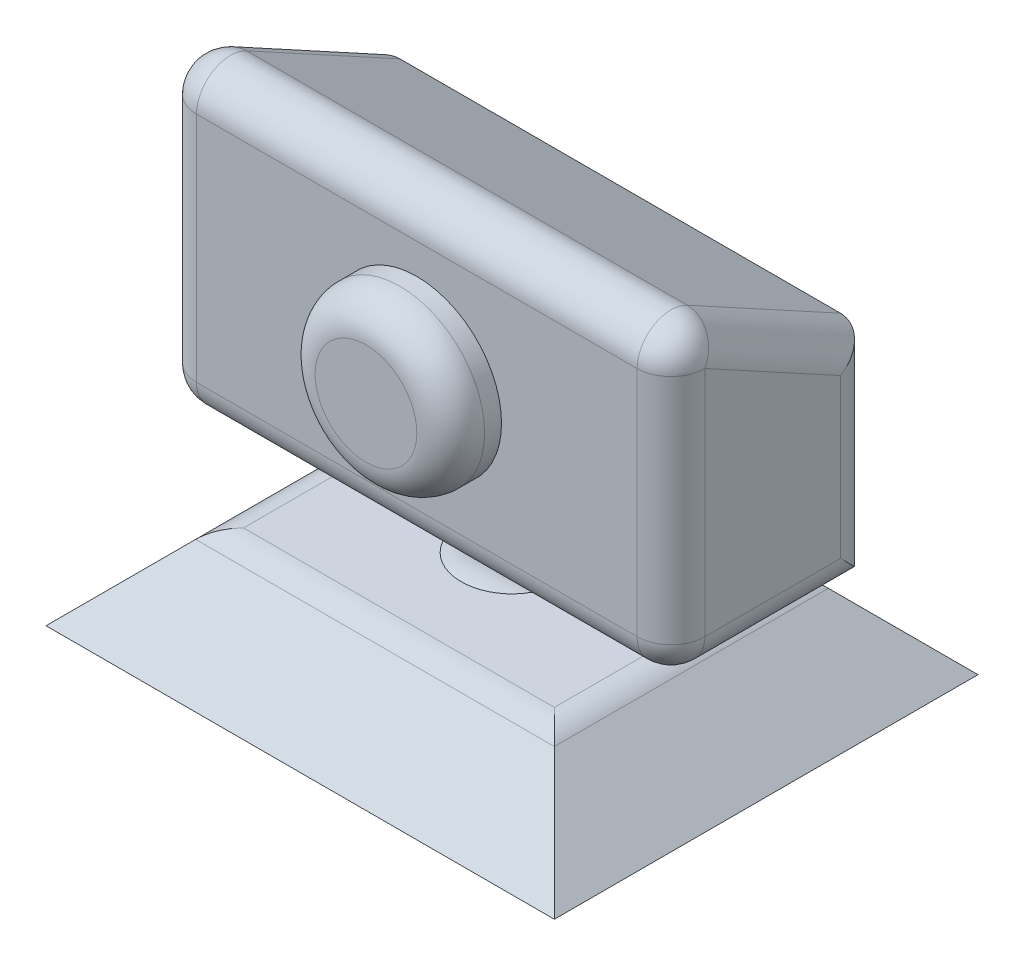
ISO-10303-21;
HEADER;
FILE_DESCRIPTION(('STEP AP214'),'2;1');
FILE_NAME('part.step','',(''),(''),'','','');
FILE_SCHEMA(('AUTOMOTIVE_DESIGN { 1 0 10303 214 1 1 1 1 }'));
ENDSEC;
DATA;
#1=APPLICATION_CONTEXT('core data for automotive mechanical design processes');
#2=APPLICATION_PROTOCOL_DEFINITION('international standard','automotive_design',2000,#1);
#3=PRODUCT_CONTEXT('',#1,'mechanical');
#4=PRODUCT('Part','Part','',(#3));
#5=PRODUCT_RELATED_PRODUCT_CATEGORY('part','',(#4));
#6=PRODUCT_DEFINITION_FORMATION('','',#4);
#7=PRODUCT_DEFINITION_CONTEXT('part definition',#1,'design');
#8=PRODUCT_DEFINITION('design','',#6,#7);
#9=PRODUCT_DEFINITION_SHAPE('','',#8);
#10=(LENGTH_UNIT() NAMED_UNIT(*) SI_UNIT(.MILLI.,.METRE.));
#11=(NAMED_UNIT(*) PLANE_ANGLE_UNIT() SI_UNIT($,.RADIAN.));
#12=(NAMED_UNIT(*) SI_UNIT($,.STERADIAN.) SOLID_ANGLE_UNIT());
#13=UNCERTAINTY_MEASURE_WITH_UNIT(LENGTH_MEASURE(1.E-05),#10,'distance_accuracy_value','');
#14=(GEOMETRIC_REPRESENTATION_CONTEXT(3) GLOBAL_UNCERTAINTY_ASSIGNED_CONTEXT((#13)) GLOBAL_UNIT_ASSIGNED_CONTEXT((#10,
#11,#12)) REPRESENTATION_CONTEXT('',''));
#15=CARTESIAN_POINT('',(0.,0.,0.));
#16=DIRECTION('',(0.,0.,1.));
#17=DIRECTION('',(1.,0.,0.));
#18=AXIS2_PLACEMENT_3D('',#15,#16,#17);
#19=CARTESIAN_POINT('',(0.,5.,0.));
#20=DIRECTION('',(0.,1.,0.));
#21=DIRECTION('',(0.,0.,1.));
#22=AXIS2_PLACEMENT_3D('',#19,#20,#21);
#23=PLANE('',#22);
#24=DIRECTION('',(0.,0.,-1.));
#25=VECTOR('',#24,1.);
#26=CARTESIAN_POINT('',(9.17157287525379,5.,0.));
#27=LINE('',#26,#25);
#28=CARTESIAN_POINT('',(9.17157287525379,5.,6.67157287525379));
#29=VERTEX_POINT('',#28);
#30=CARTESIAN_POINT('',(9.17157287525379,5.,-6.67157287525379));
#31=VERTEX_POINT('',#30);
#32=EDGE_CURVE('E288',#29,#31,#27,.T.);
#33=ORIENTED_EDGE('',*,*,#32,.T.);
#34=DIRECTION('',(-1.,0.,0.));
#35=VECTOR('',#34,1.);
#36=CARTESIAN_POINT('',(0.,5.,-6.67157287525379));
#37=LINE('',#36,#35);
#38=CARTESIAN_POINT('',(-9.17157287525379,5.,-6.67157287525379));
#39=VERTEX_POINT('',#38);
#40=EDGE_CURVE('E290',#31,#39,#37,.T.);
#41=ORIENTED_EDGE('',*,*,#40,.T.);
#42=DIRECTION('',(0.,0.,1.));
#43=VECTOR('',#42,1.);
#44=CARTESIAN_POINT('',(-9.17157287525379,5.,0.));
#45=LINE('',#44,#43);
#46=CARTESIAN_POINT('',(-9.17157287525379,5.,6.67157287525379));
#47=VERTEX_POINT('',#46);
#48=EDGE_CURVE('E236',#39,#47,#45,.T.);
#49=ORIENTED_EDGE('',*,*,#48,.T.);
#50=DIRECTION('',(1.,0.,0.));
#51=VECTOR('',#50,1.);
#52=CARTESIAN_POINT('',(0.,5.,6.67157287525379));
#53=LINE('',#52,#51);
#54=EDGE_CURVE('E286',#47,#29,#53,.T.);
#55=ORIENTED_EDGE('',*,*,#54,.T.);
#56=EDGE_LOOP('',(#33,#41,#49,#55));
#57=FACE_BOUND('',#56,.T.);
#58=CARTESIAN_POINT('',(0.,5.,0.));
#59=DIRECTION('',(0.,-1.,0.));
#60=DIRECTION('',(1.,0.,0.));
#61=AXIS2_PLACEMENT_3D('',#58,#59,#60);
#62=CIRCLE('',#61,3.);
#63=CARTESIAN_POINT('',(3.,5.,0.));
#64=VERTEX_POINT('',#63);
#65=EDGE_CURVE('E184',#64,#64,#62,.T.);
#66=ORIENTED_EDGE('',*,*,#65,.T.);
#67=EDGE_LOOP('',(#66));
#68=FACE_BOUND('',#67,.T.);
#69=ADVANCED_FACE('F44',(#57,#68),#23,.T.);
#70=CARTESIAN_POINT('',(0.,0.,0.));
#71=DIRECTION('',(0.,1.,0.));
#72=DIRECTION('',(0.,0.,1.));
#73=AXIS2_PLACEMENT_3D('',#70,#71,#72);
#74=PLANE('',#73);
#75=DIRECTION('',(0.,0.,-1.));
#76=VECTOR('',#75,1.);
#77=CARTESIAN_POINT('',(15.,0.,-12.5));
#78=LINE('',#77,#76);
#79=CARTESIAN_POINT('',(15.,0.,12.5));
#80=VERTEX_POINT('',#79);
#81=CARTESIAN_POINT('',(15.,0.,-12.5));
#82=VERTEX_POINT('',#81);
#83=EDGE_CURVE('E164',#80,#82,#78,.T.);
#84=ORIENTED_EDGE('',*,*,#83,.F.);
#85=DIRECTION('',(1.,0.,0.));
#86=VECTOR('',#85,1.);
#87=CARTESIAN_POINT('',(-15.,0.,12.5));
#88=LINE('',#87,#86);
#89=CARTESIAN_POINT('',(-15.,0.,12.5));
#90=VERTEX_POINT('',#89);
#91=EDGE_CURVE('E188',#90,#80,#88,.T.);
#92=ORIENTED_EDGE('',*,*,#91,.F.);
#93=DIRECTION('',(0.,0.,1.));
#94=VECTOR('',#93,1.);
#95=CARTESIAN_POINT('',(-15.,0.,-12.5));
#96=LINE('',#95,#94);
#97=CARTESIAN_POINT('',(-15.,0.,-12.5));
#98=VERTEX_POINT('',#97);
#99=EDGE_CURVE('E167',#98,#90,#96,.T.);
#100=ORIENTED_EDGE('',*,*,#99,.F.);
#101=DIRECTION('',(-1.,0.,0.));
#102=VECTOR('',#101,1.);
#103=CARTESIAN_POINT('',(-15.,0.,-12.5));
#104=LINE('',#103,#102);
#105=EDGE_CURVE('E159',#82,#98,#104,.T.);
#106=ORIENTED_EDGE('',*,*,#105,.F.);
#107=EDGE_LOOP('',(#84,#92,#100,#106));
#108=FACE_BOUND('',#107,.T.);
#109=ADVANCED_FACE('F161',(#108),#74,.F.);
#110=CARTESIAN_POINT('',(0.,5.,-7.49999999999998));
#111=DIRECTION('',(0.,0.707106781186549,-0.707106781186546));
#112=DIRECTION('',(1.,0.,0.));
#113=AXIS2_PLACEMENT_3D('',#110,#111,#112);
#114=PLANE('',#113);
#115=DIRECTION('',(0.577350269189627,0.577350269189624,0.577350269189626));
#116=VECTOR('',#115,1.);
#117=CARTESIAN_POINT('',(-6.66666666666665,8.33333333333333,-4.16666666666664));
#118=LINE('',#117,#116);
#119=CARTESIAN_POINT('',(-10.5857864376269,4.4142135623731,-8.08578643762688));
#120=VERTEX_POINT('',#119);
#121=EDGE_CURVE('E176',#120,#98,#118,.F.);
#122=ORIENTED_EDGE('',*,*,#121,.F.);
#123=DIRECTION('',(-1.,0.,0.));
#124=VECTOR('',#123,1.);
#125=CARTESIAN_POINT('',(0.,4.4142135623731,-8.08578643762688));
#126=LINE('',#125,#124);
#127=CARTESIAN_POINT('',(10.5857864376269,4.4142135623731,-8.08578643762688));
#128=VERTEX_POINT('',#127);
#129=EDGE_CURVE('E175',#120,#128,#126,.F.);
#130=ORIENTED_EDGE('',*,*,#129,.T.);
#131=DIRECTION('',(-0.577350269189626,0.577350269189625,0.577350269189627));
#132=VECTOR('',#131,1.);
#133=CARTESIAN_POINT('',(7.49999999999998,7.49999999999999,-4.99999999999998));
#134=LINE('',#133,#132);
#135=EDGE_CURVE('E172',#82,#128,#134,.T.);
#136=ORIENTED_EDGE('',*,*,#135,.F.);
#137=ORIENTED_EDGE('',*,*,#105,.T.);
#138=EDGE_LOOP('',(#122,#130,#136,#137));
#139=FACE_BOUND('',#138,.T.);
#140=ADVANCED_FACE('F173',(#139),#114,.T.);
#141=CARTESIAN_POINT('',(-9.99999999999998,5.,0.));
#142=DIRECTION('',(-0.707106781186546,0.707106781186549,0.));
#143=DIRECTION('',(0.,0.,-1.));
#144=AXIS2_PLACEMENT_3D('',#141,#142,#143);
#145=PLANE('',#144);
#146=DIRECTION('',(0.577350269189626,0.577350269189625,-0.577350269189627));
#147=VECTOR('',#146,1.);
#148=CARTESIAN_POINT('',(-7.49999999999998,7.49999999999999,4.99999999999998));
#149=LINE('',#148,#147);
#150=CARTESIAN_POINT('',(-10.5857864376269,4.4142135623731,8.08578643762688));
#151=VERTEX_POINT('',#150);
#152=EDGE_CURVE('E177',#151,#90,#149,.F.);
#153=ORIENTED_EDGE('',*,*,#152,.F.);
#154=DIRECTION('',(0.,0.,1.));
#155=VECTOR('',#154,1.);
#156=CARTESIAN_POINT('',(-10.5857864376269,4.4142135623731,0.));
#157=LINE('',#156,#155);
#158=EDGE_CURVE('E296',#151,#120,#157,.F.);
#159=ORIENTED_EDGE('',*,*,#158,.T.);
#160=ORIENTED_EDGE('',*,*,#121,.T.);
#161=ORIENTED_EDGE('',*,*,#99,.T.);
#162=EDGE_LOOP('',(#153,#159,#160,#161));
#163=FACE_BOUND('',#162,.T.);
#164=ADVANCED_FACE('F346',(#163),#145,.T.);
#165=CARTESIAN_POINT('',(9.99999999999997,5.,0.));
#166=DIRECTION('',(0.707106781186546,0.707106781186549,0.));
#167=DIRECTION('',(0.,0.,1.));
#168=AXIS2_PLACEMENT_3D('',#165,#166,#167);
#169=PLANE('',#168);
#170=ORIENTED_EDGE('',*,*,#135,.T.);
#171=DIRECTION('',(0.,0.,-1.));
#172=VECTOR('',#171,1.);
#173=CARTESIAN_POINT('',(10.5857864376269,4.4142135623731,0.));
#174=LINE('',#173,#172);
#175=CARTESIAN_POINT('',(10.5857864376269,4.4142135623731,8.08578643762688));
#176=VERTEX_POINT('',#175);
#177=EDGE_CURVE('E67',#128,#176,#174,.F.);
#178=ORIENTED_EDGE('',*,*,#177,.T.);
#179=DIRECTION('',(0.577350269189627,-0.577350269189624,0.577350269189626));
#180=VECTOR('',#179,1.);
#181=CARTESIAN_POINT('',(7.49999999999998,7.49999999999999,4.99999999999998));
#182=LINE('',#181,#180);
#183=EDGE_CURVE('E180',#80,#176,#182,.F.);
#184=ORIENTED_EDGE('',*,*,#183,.F.);
#185=ORIENTED_EDGE('',*,*,#83,.T.);
#186=EDGE_LOOP('',(#170,#178,#184,#185));
#187=FACE_BOUND('',#186,.T.);
#188=ADVANCED_FACE('F179',(#187),#169,.T.);
#189=CARTESIAN_POINT('',(0.,5.,7.49999999999998));
#190=DIRECTION('',(0.,0.707106781186549,0.707106781186546));
#191=DIRECTION('',(-1.,0.,0.));
#192=AXIS2_PLACEMENT_3D('',#189,#190,#191);
#193=PLANE('',#192);
#194=ORIENTED_EDGE('',*,*,#183,.T.);
#195=DIRECTION('',(1.,0.,0.));
#196=VECTOR('',#195,1.);
#197=CARTESIAN_POINT('',(0.,4.4142135623731,8.08578643762688));
#198=LINE('',#197,#196);
#199=EDGE_CURVE('E59',#176,#151,#198,.F.);
#200=ORIENTED_EDGE('',*,*,#199,.T.);
#201=ORIENTED_EDGE('',*,*,#152,.T.);
#202=ORIENTED_EDGE('',*,*,#91,.T.);
#203=EDGE_LOOP('',(#194,#200,#201,#202));
#204=FACE_BOUND('',#203,.T.);
#205=ADVANCED_FACE('F335',(#204),#193,.T.);
#206=CARTESIAN_POINT('',(0.,6.5,0.));
#207=DIRECTION('',(0.,-1.,0.));
#208=DIRECTION('',(1.,0.,0.));
#209=AXIS2_PLACEMENT_3D('',#206,#207,#208);
#210=TOROIDAL_SURFACE('',#209,4.50000000000001,2.12132034355965);
#211=CARTESIAN_POINT('',(0.,8.,0.));
#212=DIRECTION('',(0.,-1.,0.));
#213=DIRECTION('',(1.,0.,0.));
#214=AXIS2_PLACEMENT_3D('',#211,#212,#213);
#215=CIRCLE('',#214,3.);
#216=CARTESIAN_POINT('',(3.,8.,0.));
#217=VERTEX_POINT('',#216);
#218=EDGE_CURVE('E735',#217,#217,#215,.T.);
#219=ORIENTED_EDGE('',*,*,#218,.T.);
#220=EDGE_LOOP('',(#219));
#221=FACE_BOUND('',#220,.T.);
#222=ORIENTED_EDGE('',*,*,#65,.F.);
#223=EDGE_LOOP('',(#222));
#224=FACE_BOUND('',#223,.T.);
#225=ADVANCED_FACE('F331',(#221,#224),#210,.F.);
#226=CARTESIAN_POINT('',(15.,20.5324967551476,-6.38322096761608));
#227=DIRECTION('',(0.,0.,1.));
#228=DIRECTION('',(1.,0.,0.));
#229=AXIS2_PLACEMENT_3D('',#226,#227,#228);
#230=PLANE('',#229);
#231=DIRECTION('',(-1.,0.,0.));
#232=VECTOR('',#231,1.);
#233=CARTESIAN_POINT('',(15.,20.5324967551476,-6.38322096761608));
#234=LINE('',#233,#232);
#235=CARTESIAN_POINT('',(13.,20.5324967551476,-6.38322096761608));
#236=VERTEX_POINT('',#235);
#237=CARTESIAN_POINT('',(-13.,20.5324967551476,-6.38322096761608));
#238=VERTEX_POINT('',#237);
#239=EDGE_CURVE('E738',#236,#238,#234,.T.);
#240=ORIENTED_EDGE('',*,*,#239,.F.);
#241=DIRECTION('',(0.,1.,0.));
#242=VECTOR('',#241,1.);
#243=CARTESIAN_POINT('',(13.,8.,-6.38322096761608));
#244=LINE('',#243,#242);
#245=CARTESIAN_POINT('',(13.,8.,-6.38322096761608));
#246=VERTEX_POINT('',#245);
#247=EDGE_CURVE('E216',#236,#246,#244,.F.);
#248=ORIENTED_EDGE('',*,*,#247,.T.);
#249=DIRECTION('',(-1.,0.,0.));
#250=VECTOR('',#249,1.);
#251=CARTESIAN_POINT('',(15.,8.,-6.38322096761608));
#252=LINE('',#251,#250);
#253=CARTESIAN_POINT('',(-13.,8.,-6.38322096761608));
#254=VERTEX_POINT('',#253);
#255=EDGE_CURVE('E284',#246,#254,#252,.T.);
#256=ORIENTED_EDGE('',*,*,#255,.T.);
#257=DIRECTION('',(0.,1.,0.));
#258=VECTOR('',#257,1.);
#259=CARTESIAN_POINT('',(-13.,20.5324967551476,-6.38322096761608));
#260=LINE('',#259,#258);
#261=EDGE_CURVE('E214',#254,#238,#260,.T.);
#262=ORIENTED_EDGE('',*,*,#261,.T.);
#263=EDGE_LOOP('',(#240,#248,#256,#262));
#264=FACE_BOUND('',#263,.T.);
#265=ADVANCED_FACE('F625',(#264),#230,.F.);
#266=CARTESIAN_POINT('',(15.,27.0750004522799,5.61677903238392));
#267=DIRECTION('',(0.,-0.877986317810887,0.478685727525775));
#268=DIRECTION('',(0.,-0.478685727525775,-0.877986317810887));
#269=AXIS2_PLACEMENT_3D('',#266,#267,#268);
#270=PLANE('',#269);
#271=DIRECTION('',(-1.,0.,0.));
#272=VECTOR('',#271,1.);
#273=CARTESIAN_POINT('',(15.,25.4626159790743,2.65940757733238));
#274=LINE('',#273,#272);
#275=CARTESIAN_POINT('',(-13.,25.4626159790743,2.65940757733238));
#276=VERTEX_POINT('',#275);
#277=CARTESIAN_POINT('',(13.,25.4626159790743,2.65940757733238));
#278=VERTEX_POINT('',#277);
#279=EDGE_CURVE('E208',#276,#278,#274,.F.);
#280=ORIENTED_EDGE('',*,*,#279,.T.);
#281=DIRECTION('',(0.,0.478685727525775,0.877986317810887));
#282=VECTOR('',#281,1.);
#283=CARTESIAN_POINT('',(13.,20.5324967551476,-6.38322096761608));
#284=LINE('',#283,#282);
#285=EDGE_CURVE('E212',#278,#236,#284,.F.);
#286=ORIENTED_EDGE('',*,*,#285,.T.);
#287=ORIENTED_EDGE('',*,*,#239,.T.);
#288=DIRECTION('',(0.,0.478685727525775,0.877986317810887));
#289=VECTOR('',#288,1.);
#290=CARTESIAN_POINT('',(-13.,27.0750004522799,5.61677903238392));
#291=LINE('',#290,#289);
#292=EDGE_CURVE('E210',#238,#276,#291,.T.);
#293=ORIENTED_EDGE('',*,*,#292,.T.);
#294=EDGE_LOOP('',(#280,#286,#287,#293));
#295=FACE_BOUND('',#294,.T.);
#296=ADVANCED_FACE('F616',(#295),#270,.F.);
#297=CARTESIAN_POINT('',(15.,27.0750004522799,5.61677903238392));
#298=DIRECTION('',(0.,0.,-1.));
#299=DIRECTION('',(0.,1.,0.));
#300=AXIS2_PLACEMENT_3D('',#297,#298,#299);
#301=PLANE('',#300);
#302=CARTESIAN_POINT('',(0.,16.913633245173,5.61677903238392));
#303=DIRECTION('',(0.,0.,-1.));
#304=DIRECTION('',(0.,1.,0.));
#305=AXIS2_PLACEMENT_3D('',#302,#303,#304);
#306=CIRCLE('',#305,5.);
#307=CARTESIAN_POINT('',(0.,21.913633245173,5.61677903238392));
#308=VERTEX_POINT('',#307);
#309=EDGE_CURVE('E298',#308,#308,#306,.F.);
#310=ORIENTED_EDGE('',*,*,#309,.F.);
#311=EDGE_LOOP('',(#310));
#312=FACE_BOUND('',#311,.T.);
#313=DIRECTION('',(0.,-1.,0.));
#314=VECTOR('',#313,1.);
#315=CARTESIAN_POINT('',(13.,27.0750004522799,5.61677903238392));
#316=LINE('',#315,#314);
#317=CARTESIAN_POINT('',(13.,10.,5.61677903238392));
#318=VERTEX_POINT('',#317);
#319=CARTESIAN_POINT('',(13.,23.7066433434525,5.61677903238392));
#320=VERTEX_POINT('',#319);
#321=EDGE_CURVE('E231',#318,#320,#316,.F.);
#322=ORIENTED_EDGE('',*,*,#321,.T.);
#323=DIRECTION('',(-1.,0.,0.));
#324=VECTOR('',#323,1.);
#325=CARTESIAN_POINT('',(15.,23.7066433434525,5.61677903238392));
#326=LINE('',#325,#324);
#327=CARTESIAN_POINT('',(-13.,23.7066433434525,5.61677903238392));
#328=VERTEX_POINT('',#327);
#329=EDGE_CURVE('E233',#320,#328,#326,.T.);
#330=ORIENTED_EDGE('',*,*,#329,.T.);
#331=DIRECTION('',(0.,-1.,0.));
#332=VECTOR('',#331,1.);
#333=CARTESIAN_POINT('',(-13.,27.0750004522799,5.61677903238392));
#334=LINE('',#333,#332);
#335=CARTESIAN_POINT('',(-13.,10.,5.61677903238392));
#336=VERTEX_POINT('',#335);
#337=EDGE_CURVE('E227',#328,#336,#334,.T.);
#338=ORIENTED_EDGE('',*,*,#337,.T.);
#339=DIRECTION('',(-1.,0.,0.));
#340=VECTOR('',#339,1.);
#341=CARTESIAN_POINT('',(15.,10.,5.61677903238392));
#342=LINE('',#341,#340);
#343=EDGE_CURVE('E229',#336,#318,#342,.F.);
#344=ORIENTED_EDGE('',*,*,#343,.T.);
#345=EDGE_LOOP('',(#322,#330,#338,#344));
#346=FACE_BOUND('',#345,.T.);
#347=ADVANCED_FACE('F606',(#312,#346),#301,.F.);
#348=CARTESIAN_POINT('',(15.,8.,5.61677903238392));
#349=DIRECTION('',(0.,1.,0.));
#350=DIRECTION('',(0.,0.,1.));
#351=AXIS2_PLACEMENT_3D('',#348,#349,#350);
#352=PLANE('',#351);
#353=ORIENTED_EDGE('',*,*,#255,.F.);
#354=DIRECTION('',(0.,0.,-1.));
#355=VECTOR('',#354,1.);
#356=CARTESIAN_POINT('',(13.,8.,5.61677903238392));
#357=LINE('',#356,#355);
#358=CARTESIAN_POINT('',(13.,8.,3.61677903238392));
#359=VERTEX_POINT('',#358);
#360=EDGE_CURVE('E205',#246,#359,#357,.F.);
#361=ORIENTED_EDGE('',*,*,#360,.T.);
#362=DIRECTION('',(-1.,0.,0.));
#363=VECTOR('',#362,1.);
#364=CARTESIAN_POINT('',(15.,8.,3.61677903238392));
#365=LINE('',#364,#363);
#366=CARTESIAN_POINT('',(-13.,8.,3.61677903238392));
#367=VERTEX_POINT('',#366);
#368=EDGE_CURVE('E201',#359,#367,#365,.T.);
#369=ORIENTED_EDGE('',*,*,#368,.T.);
#370=DIRECTION('',(0.,0.,-1.));
#371=VECTOR('',#370,1.);
#372=CARTESIAN_POINT('',(-13.,8.,5.61677903238392));
#373=LINE('',#372,#371);
#374=EDGE_CURVE('E203',#367,#254,#373,.T.);
#375=ORIENTED_EDGE('',*,*,#374,.T.);
#376=EDGE_LOOP('',(#353,#361,#369,#375));
#377=FACE_BOUND('',#376,.T.);
#378=ORIENTED_EDGE('',*,*,#218,.F.);
#379=EDGE_LOOP('',(#378));
#380=FACE_BOUND('',#379,.T.);
#381=ADVANCED_FACE('F596',(#377,#380),#352,.F.);
#382=CARTESIAN_POINT('',(15.,0.,0.));
#383=DIRECTION('',(1.,0.,0.));
#384=DIRECTION('',(0.,0.,-1.));
#385=AXIS2_PLACEMENT_3D('',#382,#383,#384);
#386=PLANE('',#385);
#387=DIRECTION('',(0.,0.,-1.));
#388=VECTOR('',#387,1.);
#389=CARTESIAN_POINT('',(15.,10.,-6.38322096761608));
#390=LINE('',#389,#388);
#391=CARTESIAN_POINT('',(15.,10.,3.61677903238392));
#392=VERTEX_POINT('',#391);
#393=CARTESIAN_POINT('',(15.,10.,-4.38322096761608));
#394=VERTEX_POINT('',#393);
#395=EDGE_CURVE('E196',#392,#394,#390,.T.);
#396=ORIENTED_EDGE('',*,*,#395,.T.);
#397=DIRECTION('',(0.,1.,0.));
#398=VECTOR('',#397,1.);
#399=CARTESIAN_POINT('',(15.,20.5324967551476,-4.38322096761608));
#400=LINE('',#399,#398);
#401=CARTESIAN_POINT('',(15.,19.3449742120309,-4.38322096761608));
#402=VERTEX_POINT('',#401);
#403=EDGE_CURVE('E199',#394,#402,#400,.T.);
#404=ORIENTED_EDGE('',*,*,#403,.T.);
#405=DIRECTION('',(0.,0.478685727525775,0.877986317810887));
#406=VECTOR('',#405,1.);
#407=CARTESIAN_POINT('',(15.,25.3190278166582,6.57415048743548));
#408=LINE('',#407,#406);
#409=CARTESIAN_POINT('',(15.,23.7066433434525,3.61677903238392));
#410=VERTEX_POINT('',#409);
#411=EDGE_CURVE('E194',#402,#410,#408,.T.);
#412=ORIENTED_EDGE('',*,*,#411,.T.);
#413=DIRECTION('',(0.,-1.,0.));
#414=VECTOR('',#413,1.);
#415=CARTESIAN_POINT('',(15.,8.,3.61677903238392));
#416=LINE('',#415,#414);
#417=EDGE_CURVE('E190',#410,#392,#416,.T.);
#418=ORIENTED_EDGE('',*,*,#417,.T.);
#419=EDGE_LOOP('',(#396,#404,#412,#418));
#420=FACE_BOUND('',#419,.T.);
#421=ADVANCED_FACE('F586',(#420),#386,.T.);
#422=CARTESIAN_POINT('',(-15.,0.,0.));
#423=DIRECTION('',(1.,0.,0.));
#424=DIRECTION('',(0.,0.,-1.));
#425=AXIS2_PLACEMENT_3D('',#422,#423,#424);
#426=PLANE('',#425);
#427=DIRECTION('',(0.,0.478685727525775,0.877986317810887));
#428=VECTOR('',#427,1.);
#429=CARTESIAN_POINT('',(-15.,16.7544443244578,-9.13466782801352));
#430=LINE('',#429,#428);
#431=CARTESIAN_POINT('',(-15.,23.7066433434525,3.61677903238392));
#432=VERTEX_POINT('',#431);
#433=CARTESIAN_POINT('',(-15.,19.3449742120309,-4.38322096761608));
#434=VERTEX_POINT('',#433);
#435=EDGE_CURVE('E222',#432,#434,#430,.F.);
#436=ORIENTED_EDGE('',*,*,#435,.T.);
#437=DIRECTION('',(0.,1.,0.));
#438=VECTOR('',#437,1.);
#439=CARTESIAN_POINT('',(-15.,0.,-4.38322096761608));
#440=LINE('',#439,#438);
#441=CARTESIAN_POINT('',(-15.,10.,-4.38322096761608));
#442=VERTEX_POINT('',#441);
#443=EDGE_CURVE('E225',#434,#442,#440,.F.);
#444=ORIENTED_EDGE('',*,*,#443,.T.);
#445=DIRECTION('',(0.,0.,-1.));
#446=VECTOR('',#445,1.);
#447=CARTESIAN_POINT('',(-15.,10.,0.));
#448=LINE('',#447,#446);
#449=CARTESIAN_POINT('',(-15.,10.,3.61677903238392));
#450=VERTEX_POINT('',#449);
#451=EDGE_CURVE('E220',#442,#450,#448,.F.);
#452=ORIENTED_EDGE('',*,*,#451,.T.);
#453=DIRECTION('',(0.,-1.,0.));
#454=VECTOR('',#453,1.);
#455=CARTESIAN_POINT('',(-15.,0.,3.61677903238392));
#456=LINE('',#455,#454);
#457=EDGE_CURVE('E218',#450,#432,#456,.F.);
#458=ORIENTED_EDGE('',*,*,#457,.T.);
#459=EDGE_LOOP('',(#436,#444,#452,#458));
#460=FACE_BOUND('',#459,.T.);
#461=ADVANCED_FACE('F413',(#460),#426,.F.);
#462=CARTESIAN_POINT('',(-13.,25.3190278166582,6.57415048743547));
#463=DIRECTION('',(0.,0.478685727525775,0.877986317810887));
#464=DIRECTION('',(0.,-0.877986317810887,0.478685727525775));
#465=AXIS2_PLACEMENT_3D('',#462,#463,#464);
#466=CYLINDRICAL_SURFACE('',#465,2.);
#467=CARTESIAN_POINT('',(-13.,23.7066433434525,3.61677903238392));
#468=DIRECTION('',(0.,0.478685727525774,0.877986317810887));
#469=DIRECTION('',(0.,-0.877986317810887,0.478685727525774));
#470=AXIS2_PLACEMENT_3D('',#467,#468,#469);
#471=CIRCLE('',#470,2.);
#472=EDGE_CURVE('E278',#276,#432,#471,.T.);
#473=ORIENTED_EDGE('',*,*,#472,.F.);
#474=ORIENTED_EDGE('',*,*,#292,.F.);
#475=CARTESIAN_POINT('',(-13.,19.3449742120309,-4.38322096761608));
#476=DIRECTION('',(0.,0.859850489191515,0.510545919812423));
#477=DIRECTION('',(0.,0.510545919812423,-0.859850489191515));
#478=AXIS2_PLACEMENT_3D('',#475,#476,#477);
#479=ELLIPSE('',#478,2.32598576745653,2.);
#480=EDGE_CURVE('E281',#434,#238,#479,.F.);
#481=ORIENTED_EDGE('',*,*,#480,.F.);
#482=ORIENTED_EDGE('',*,*,#435,.F.);
#483=EDGE_LOOP('',(#473,#474,#481,#482));
#484=FACE_BOUND('',#483,.T.);
#485=ADVANCED_FACE('F409',(#484),#466,.T.);
#486=CARTESIAN_POINT('',(-13.,20.5324967551476,-4.38322096761608));
#487=DIRECTION('',(0.,1.,0.));
#488=DIRECTION('',(0.,0.,1.));
#489=AXIS2_PLACEMENT_3D('',#486,#487,#488);
#490=CYLINDRICAL_SURFACE('',#489,2.);
#491=ORIENTED_EDGE('',*,*,#480,.T.);
#492=ORIENTED_EDGE('',*,*,#261,.F.);
#493=CARTESIAN_POINT('',(-13.,10.,-4.38322096761608));
#494=DIRECTION('',(0.,0.707106781186548,-0.707106781186547));
#495=DIRECTION('',(0.,0.707106781186547,0.707106781186548));
#496=AXIS2_PLACEMENT_3D('',#493,#494,#495);
#497=ELLIPSE('',#496,2.82842712474619,2.);
#498=EDGE_CURVE('E275',#442,#254,#497,.F.);
#499=ORIENTED_EDGE('',*,*,#498,.F.);
#500=ORIENTED_EDGE('',*,*,#443,.F.);
#501=EDGE_LOOP('',(#491,#492,#499,#500));
#502=FACE_BOUND('',#501,.T.);
#503=ADVANCED_FACE('F405',(#502),#490,.T.);
#504=CARTESIAN_POINT('',(-13.,23.7066433434525,3.61677903238392));
#505=DIRECTION('',(-1.,0.,0.));
#506=DIRECTION('',(0.,-1.,0.));
#507=AXIS2_PLACEMENT_3D('',#504,#505,#506);
#508=SPHERICAL_SURFACE('',#507,2.);
#509=CARTESIAN_POINT('',(-13.,23.7066433434525,3.61677903238392));
#510=DIRECTION('',(-1.,0.,0.));
#511=DIRECTION('',(0.,0.,1.));
#512=AXIS2_PLACEMENT_3D('',#509,#510,#511);
#513=CIRCLE('',#512,2.);
#514=EDGE_CURVE('E269',#276,#328,#513,.F.);
#515=ORIENTED_EDGE('',*,*,#514,.F.);
#516=ORIENTED_EDGE('',*,*,#472,.T.);
#517=CARTESIAN_POINT('',(-13.,23.7066433434525,3.61677903238392));
#518=DIRECTION('',(0.,1.,0.));
#519=DIRECTION('',(0.,0.,1.));
#520=AXIS2_PLACEMENT_3D('',#517,#518,#519);
#521=CIRCLE('',#520,2.);
#522=EDGE_CURVE('E272',#328,#432,#521,.F.);
#523=ORIENTED_EDGE('',*,*,#522,.F.);
#524=EDGE_LOOP('',(#515,#516,#523));
#525=FACE_BOUND('',#524,.T.);
#526=ADVANCED_FACE('F401',(#525),#508,.T.);
#527=CARTESIAN_POINT('',(-13.,10.,5.61677903238392));
#528=DIRECTION('',(0.,0.,-1.));
#529=DIRECTION('',(0.,1.,0.));
#530=AXIS2_PLACEMENT_3D('',#527,#528,#529);
#531=CYLINDRICAL_SURFACE('',#530,2.);
#532=ORIENTED_EDGE('',*,*,#498,.T.);
#533=ORIENTED_EDGE('',*,*,#374,.F.);
#534=CARTESIAN_POINT('',(-13.,10.,3.61677903238392));
#535=DIRECTION('',(0.,0.,1.));
#536=DIRECTION('',(0.,-1.,0.));
#537=AXIS2_PLACEMENT_3D('',#534,#535,#536);
#538=CIRCLE('',#537,2.);
#539=EDGE_CURVE('E266',#450,#367,#538,.T.);
#540=ORIENTED_EDGE('',*,*,#539,.F.);
#541=ORIENTED_EDGE('',*,*,#451,.F.);
#542=EDGE_LOOP('',(#532,#533,#540,#541));
#543=FACE_BOUND('',#542,.T.);
#544=ADVANCED_FACE('F397',(#543),#531,.T.);
#545=CARTESIAN_POINT('',(-13.,27.0750004522799,3.61677903238392));
#546=DIRECTION('',(0.,-1.,0.));
#547=DIRECTION('',(0.,0.,-1.));
#548=AXIS2_PLACEMENT_3D('',#545,#546,#547);
#549=CYLINDRICAL_SURFACE('',#548,2.);
#550=ORIENTED_EDGE('',*,*,#522,.T.);
#551=ORIENTED_EDGE('',*,*,#457,.F.);
#552=CARTESIAN_POINT('',(-13.,10.,3.61677903238392));
#553=DIRECTION('',(0.,-1.,0.));
#554=DIRECTION('',(0.,0.,-1.));
#555=AXIS2_PLACEMENT_3D('',#552,#553,#554);
#556=CIRCLE('',#555,2.);
#557=EDGE_CURVE('E263',#336,#450,#556,.T.);
#558=ORIENTED_EDGE('',*,*,#557,.F.);
#559=ORIENTED_EDGE('',*,*,#337,.F.);
#560=EDGE_LOOP('',(#550,#551,#558,#559));
#561=FACE_BOUND('',#560,.T.);
#562=ADVANCED_FACE('F393',(#561),#549,.T.);
#563=CARTESIAN_POINT('',(15.,23.7066433434525,3.61677903238392));
#564=DIRECTION('',(-1.,0.,0.));
#565=DIRECTION('',(0.,0.,1.));
#566=AXIS2_PLACEMENT_3D('',#563,#564,#565);
#567=CYLINDRICAL_SURFACE('',#566,2.);
#568=ORIENTED_EDGE('',*,*,#514,.T.);
#569=ORIENTED_EDGE('',*,*,#329,.F.);
#570=CARTESIAN_POINT('',(13.,23.7066433434525,3.61677903238392));
#571=DIRECTION('',(1.,0.,0.));
#572=DIRECTION('',(0.,0.,-1.));
#573=AXIS2_PLACEMENT_3D('',#570,#571,#572);
#574=CIRCLE('',#573,2.);
#575=EDGE_CURVE('E260',#278,#320,#574,.T.);
#576=ORIENTED_EDGE('',*,*,#575,.F.);
#577=ORIENTED_EDGE('',*,*,#279,.F.);
#578=EDGE_LOOP('',(#568,#569,#576,#577));
#579=FACE_BOUND('',#578,.T.);
#580=ADVANCED_FACE('F389',(#579),#567,.T.);
#581=CARTESIAN_POINT('',(-13.,10.,3.61677903238392));
#582=DIRECTION('',(-1.,0.,0.));
#583=DIRECTION('',(0.,0.,1.));
#584=AXIS2_PLACEMENT_3D('',#581,#582,#583);
#585=SPHERICAL_SURFACE('',#584,2.);
#586=ORIENTED_EDGE('',*,*,#557,.T.);
#587=ORIENTED_EDGE('',*,*,#539,.T.);
#588=CARTESIAN_POINT('',(-13.,10.,3.61677903238392));
#589=DIRECTION('',(-1.,0.,0.));
#590=DIRECTION('',(0.,0.,1.));
#591=AXIS2_PLACEMENT_3D('',#588,#589,#590);
#592=CIRCLE('',#591,2.);
#593=EDGE_CURVE('E257',#336,#367,#592,.F.);
#594=ORIENTED_EDGE('',*,*,#593,.F.);
#595=EDGE_LOOP('',(#586,#587,#594));
#596=FACE_BOUND('',#595,.T.);
#597=ADVANCED_FACE('F385',(#596),#585,.T.);
#598=CARTESIAN_POINT('',(13.,23.7066433434525,3.61677903238392));
#599=DIRECTION('',(1.,0.,0.));
#600=DIRECTION('',(0.,1.,0.));
#601=AXIS2_PLACEMENT_3D('',#598,#599,#600);
#602=SPHERICAL_SURFACE('',#601,2.);
#603=CARTESIAN_POINT('',(13.,23.7066433434525,3.61677903238392));
#604=DIRECTION('',(0.,0.478685727525773,0.877986317810888));
#605=DIRECTION('',(0.,-0.877986317810888,0.478685727525773));
#606=AXIS2_PLACEMENT_3D('',#603,#604,#605);
#607=CIRCLE('',#606,2.);
#608=EDGE_CURVE('E251',#278,#410,#607,.F.);
#609=ORIENTED_EDGE('',*,*,#608,.F.);
#610=ORIENTED_EDGE('',*,*,#575,.T.);
#611=CARTESIAN_POINT('',(13.,23.7066433434525,3.61677903238392));
#612=DIRECTION('',(0.,1.,0.));
#613=DIRECTION('',(-1.,0.,0.));
#614=AXIS2_PLACEMENT_3D('',#611,#612,#613);
#615=CIRCLE('',#614,2.);
#616=EDGE_CURVE('E254',#410,#320,#615,.F.);
#617=ORIENTED_EDGE('',*,*,#616,.F.);
#618=EDGE_LOOP('',(#609,#610,#617));
#619=FACE_BOUND('',#618,.T.);
#620=ADVANCED_FACE('F381',(#619),#602,.T.);
#621=CARTESIAN_POINT('',(15.,10.,3.61677903238392));
#622=DIRECTION('',(-1.,0.,0.));
#623=DIRECTION('',(0.,0.,1.));
#624=AXIS2_PLACEMENT_3D('',#621,#622,#623);
#625=CYLINDRICAL_SURFACE('',#624,2.);
#626=ORIENTED_EDGE('',*,*,#593,.T.);
#627=ORIENTED_EDGE('',*,*,#368,.F.);
#628=CARTESIAN_POINT('',(13.,10.,3.61677903238392));
#629=DIRECTION('',(1.,0.,0.));
#630=DIRECTION('',(0.,0.,-1.));
#631=AXIS2_PLACEMENT_3D('',#628,#629,#630);
#632=CIRCLE('',#631,2.);
#633=EDGE_CURVE('E248',#318,#359,#632,.T.);
#634=ORIENTED_EDGE('',*,*,#633,.F.);
#635=ORIENTED_EDGE('',*,*,#343,.F.);
#636=EDGE_LOOP('',(#626,#627,#634,#635));
#637=FACE_BOUND('',#636,.T.);
#638=ADVANCED_FACE('F377',(#637),#625,.T.);
#639=CARTESIAN_POINT('',(13.,0.,3.61677903238392));
#640=DIRECTION('',(0.,1.,0.));
#641=DIRECTION('',(0.,0.,1.));
#642=AXIS2_PLACEMENT_3D('',#639,#640,#641);
#643=CYLINDRICAL_SURFACE('',#642,2.);
#644=ORIENTED_EDGE('',*,*,#616,.T.);
#645=ORIENTED_EDGE('',*,*,#321,.F.);
#646=CARTESIAN_POINT('',(13.,10.,3.61677903238392));
#647=DIRECTION('',(0.,-1.,0.));
#648=DIRECTION('',(0.,0.,-1.));
#649=AXIS2_PLACEMENT_3D('',#646,#647,#648);
#650=CIRCLE('',#649,2.);
#651=EDGE_CURVE('E245',#392,#318,#650,.T.);
#652=ORIENTED_EDGE('',*,*,#651,.F.);
#653=ORIENTED_EDGE('',*,*,#417,.F.);
#654=EDGE_LOOP('',(#644,#645,#652,#653));
#655=FACE_BOUND('',#654,.T.);
#656=ADVANCED_FACE('F373',(#655),#643,.T.);
#657=CARTESIAN_POINT('',(13.,16.7544443244578,-9.13466782801352));
#658=DIRECTION('',(0.,-0.478685727525775,-0.877986317810887));
#659=DIRECTION('',(0.,0.877986317810887,-0.478685727525775));
#660=AXIS2_PLACEMENT_3D('',#657,#658,#659);
#661=CYLINDRICAL_SURFACE('',#660,2.);
#662=ORIENTED_EDGE('',*,*,#608,.T.);
#663=ORIENTED_EDGE('',*,*,#411,.F.);
#664=CARTESIAN_POINT('',(13.,19.3449742120309,-4.38322096761608));
#665=DIRECTION('',(0.,-0.859850489191515,-0.510545919812423));
#666=DIRECTION('',(0.,-0.510545919812423,0.859850489191515));
#667=AXIS2_PLACEMENT_3D('',#664,#665,#666);
#668=ELLIPSE('',#667,2.32598576745653,2.);
#669=EDGE_CURVE('E242',#236,#402,#668,.T.);
#670=ORIENTED_EDGE('',*,*,#669,.F.);
#671=ORIENTED_EDGE('',*,*,#285,.F.);
#672=EDGE_LOOP('',(#662,#663,#670,#671));
#673=FACE_BOUND('',#672,.T.);
#674=ADVANCED_FACE('F369',(#673),#661,.T.);
#675=CARTESIAN_POINT('',(13.,10.,3.61677903238392));
#676=DIRECTION('',(0.,0.,1.));
#677=DIRECTION('',(1.,0.,0.));
#678=AXIS2_PLACEMENT_3D('',#675,#676,#677);
#679=SPHERICAL_SURFACE('',#678,2.);
#680=ORIENTED_EDGE('',*,*,#651,.T.);
#681=ORIENTED_EDGE('',*,*,#633,.T.);
#682=CARTESIAN_POINT('',(13.,10.,3.61677903238392));
#683=DIRECTION('',(0.,0.,1.));
#684=DIRECTION('',(0.,-1.,0.));
#685=AXIS2_PLACEMENT_3D('',#682,#683,#684);
#686=CIRCLE('',#685,2.);
#687=EDGE_CURVE('E239',#392,#359,#686,.F.);
#688=ORIENTED_EDGE('',*,*,#687,.F.);
#689=EDGE_LOOP('',(#680,#681,#688));
#690=FACE_BOUND('',#689,.T.);
#691=ADVANCED_FACE('F365',(#690),#679,.T.);
#692=CARTESIAN_POINT('',(13.,0.,-4.38322096761608));
#693=DIRECTION('',(0.,-1.,0.));
#694=DIRECTION('',(0.,0.,-1.));
#695=AXIS2_PLACEMENT_3D('',#692,#693,#694);
#696=CYLINDRICAL_SURFACE('',#695,2.);
#697=ORIENTED_EDGE('',*,*,#669,.T.);
#698=ORIENTED_EDGE('',*,*,#403,.F.);
#699=CARTESIAN_POINT('',(13.,10.,-4.38322096761608));
#700=DIRECTION('',(0.,-0.707106781186548,0.707106781186547));
#701=DIRECTION('',(0.,-0.707106781186547,-0.707106781186548));
#702=AXIS2_PLACEMENT_3D('',#699,#700,#701);
#703=ELLIPSE('',#702,2.82842712474619,2.);
#704=EDGE_CURVE('E237',#246,#394,#703,.T.);
#705=ORIENTED_EDGE('',*,*,#704,.F.);
#706=ORIENTED_EDGE('',*,*,#247,.F.);
#707=EDGE_LOOP('',(#697,#698,#705,#706));
#708=FACE_BOUND('',#707,.T.);
#709=ADVANCED_FACE('F361',(#708),#696,.T.);
#710=CARTESIAN_POINT('',(13.,10.,0.));
#711=DIRECTION('',(0.,0.,1.));
#712=DIRECTION('',(0.,-1.,0.));
#713=AXIS2_PLACEMENT_3D('',#710,#711,#712);
#714=CYLINDRICAL_SURFACE('',#713,2.);
#715=ORIENTED_EDGE('',*,*,#687,.T.);
#716=ORIENTED_EDGE('',*,*,#360,.F.);
#717=ORIENTED_EDGE('',*,*,#704,.T.);
#718=ORIENTED_EDGE('',*,*,#395,.F.);
#719=EDGE_LOOP('',(#715,#716,#717,#718));
#720=FACE_BOUND('',#719,.T.);
#721=ADVANCED_FACE('F357',(#720),#714,.T.);
#722=CARTESIAN_POINT('',(0.,3.,6.67157287525379));
#723=DIRECTION('',(1.,0.,0.));
#724=DIRECTION('',(0.,0.,-1.));
#725=AXIS2_PLACEMENT_3D('',#722,#723,#724);
#726=CYLINDRICAL_SURFACE('',#725,2.);
#727=CARTESIAN_POINT('',(-9.17157287525379,3.,6.67157287525379));
#728=DIRECTION('',(0.707106781186548,0.,0.707106781186547));
#729=DIRECTION('',(-0.707106781186547,0.,0.707106781186548));
#730=AXIS2_PLACEMENT_3D('',#727,#728,#729);
#731=ELLIPSE('',#730,2.82842712474619,2.);
#732=EDGE_CURVE('E303',#151,#47,#731,.F.);
#733=ORIENTED_EDGE('',*,*,#732,.F.);
#734=ORIENTED_EDGE('',*,*,#199,.F.);
#735=CARTESIAN_POINT('',(9.17157287525379,3.,6.67157287525379));
#736=DIRECTION('',(0.707106781186547,0.,-0.707106781186548));
#737=DIRECTION('',(0.707106781186548,0.,0.707106781186547));
#738=AXIS2_PLACEMENT_3D('',#735,#736,#737);
#739=ELLIPSE('',#738,2.82842712474619,2.);
#740=EDGE_CURVE('E240',#29,#176,#739,.T.);
#741=ORIENTED_EDGE('',*,*,#740,.F.);
#742=ORIENTED_EDGE('',*,*,#54,.F.);
#743=EDGE_LOOP('',(#733,#734,#741,#742));
#744=FACE_BOUND('',#743,.T.);
#745=ADVANCED_FACE('F360',(#744),#726,.T.);
#746=CARTESIAN_POINT('',(9.17157287525379,3.,0.));
#747=DIRECTION('',(0.,0.,-1.));
#748=DIRECTION('',(-1.,0.,0.));
#749=AXIS2_PLACEMENT_3D('',#746,#747,#748);
#750=CYLINDRICAL_SURFACE('',#749,2.);
#751=ORIENTED_EDGE('',*,*,#740,.T.);
#752=ORIENTED_EDGE('',*,*,#177,.F.);
#753=CARTESIAN_POINT('',(9.17157287525379,3.,-6.67157287525379));
#754=DIRECTION('',(-0.707106781186548,0.,-0.707106781186547));
#755=DIRECTION('',(0.707106781186547,0.,-0.707106781186548));
#756=AXIS2_PLACEMENT_3D('',#753,#754,#755);
#757=ELLIPSE('',#756,2.82842712474619,2.);
#758=EDGE_CURVE('E301',#31,#128,#757,.T.);
#759=ORIENTED_EDGE('',*,*,#758,.F.);
#760=ORIENTED_EDGE('',*,*,#32,.F.);
#761=EDGE_LOOP('',(#751,#752,#759,#760));
#762=FACE_BOUND('',#761,.T.);
#763=ADVANCED_FACE('F422',(#762),#750,.T.);
#764=CARTESIAN_POINT('',(-9.17157287525379,3.,0.));
#765=DIRECTION('',(0.,0.,1.));
#766=DIRECTION('',(1.,0.,0.));
#767=AXIS2_PLACEMENT_3D('',#764,#765,#766);
#768=CYLINDRICAL_SURFACE('',#767,2.);
#769=ORIENTED_EDGE('',*,*,#732,.T.);
#770=ORIENTED_EDGE('',*,*,#48,.F.);
#771=CARTESIAN_POINT('',(-9.1715728752538,3.,-6.67157287525379));
#772=DIRECTION('',(-0.707106781186547,0.,0.707106781186548));
#773=DIRECTION('',(0.707106781186548,0.,0.707106781186547));
#774=AXIS2_PLACEMENT_3D('',#771,#772,#773);
#775=ELLIPSE('',#774,2.82842712474619,2.);
#776=EDGE_CURVE('E299',#120,#39,#775,.F.);
#777=ORIENTED_EDGE('',*,*,#776,.F.);
#778=ORIENTED_EDGE('',*,*,#158,.F.);
#779=EDGE_LOOP('',(#769,#770,#777,#778));
#780=FACE_BOUND('',#779,.T.);
#781=ADVANCED_FACE('F418',(#780),#768,.T.);
#782=CARTESIAN_POINT('',(0.,3.,-6.67157287525379));
#783=DIRECTION('',(-1.,0.,0.));
#784=DIRECTION('',(0.,0.,1.));
#785=AXIS2_PLACEMENT_3D('',#782,#783,#784);
#786=CYLINDRICAL_SURFACE('',#785,2.);
#787=ORIENTED_EDGE('',*,*,#758,.T.);
#788=ORIENTED_EDGE('',*,*,#129,.F.);
#789=ORIENTED_EDGE('',*,*,#776,.T.);
#790=ORIENTED_EDGE('',*,*,#40,.F.);
#791=EDGE_LOOP('',(#787,#788,#789,#790));
#792=FACE_BOUND('',#791,.T.);
#793=ADVANCED_FACE('F415',(#792),#786,.T.);
#794=CARTESIAN_POINT('',(0.,16.913633245173,8.61677903238392));
#795=DIRECTION('',(0.,0.,-1.));
#796=DIRECTION('',(-1.,0.,0.));
#797=AXIS2_PLACEMENT_3D('',#794,#795,#796);
#798=CYLINDRICAL_SURFACE('',#797,5.);
#799=CARTESIAN_POINT('',(0.,16.913633245173,6.61677903238392));
#800=DIRECTION('',(0.,0.,1.));
#801=DIRECTION('',(1.,0.,0.));
#802=AXIS2_PLACEMENT_3D('',#799,#800,#801);
#803=CIRCLE('',#802,5.);
#804=CARTESIAN_POINT('',(5.,16.913633245173,6.61677903238392));
#805=VERTEX_POINT('',#804);
#806=EDGE_CURVE('E11',#805,#805,#803,.F.);
#807=ORIENTED_EDGE('',*,*,#806,.T.);
#808=EDGE_LOOP('',(#807));
#809=FACE_BOUND('',#808,.T.);
#810=ORIENTED_EDGE('',*,*,#309,.T.);
#811=EDGE_LOOP('',(#810));
#812=FACE_BOUND('',#811,.T.);
#813=ADVANCED_FACE('F319',(#809,#812),#798,.T.);
#814=CARTESIAN_POINT('',(0.,16.913633245173,8.61677903238392));
#815=DIRECTION('',(0.,0.,1.));
#816=DIRECTION('',(1.,0.,0.));
#817=AXIS2_PLACEMENT_3D('',#814,#815,#816);
#818=PLANE('',#817);
#819=CARTESIAN_POINT('',(0.,16.913633245173,8.61677903238392));
#820=DIRECTION('',(0.,0.,1.));
#821=DIRECTION('',(1.,0.,0.));
#822=AXIS2_PLACEMENT_3D('',#819,#820,#821);
#823=CIRCLE('',#822,3.);
#824=CARTESIAN_POINT('',(3.,16.913633245173,8.61677903238392));
#825=VERTEX_POINT('',#824);
#826=EDGE_CURVE('E52',#825,#825,#823,.T.);
#827=ORIENTED_EDGE('',*,*,#826,.T.);
#828=EDGE_LOOP('',(#827));
#829=FACE_BOUND('',#828,.T.);
#830=ADVANCED_FACE('F312',(#829),#818,.T.);
#831=CARTESIAN_POINT('',(0.,16.913633245173,6.61677903238392));
#832=DIRECTION('',(0.,0.,1.));
#833=DIRECTION('',(1.,0.,0.));
#834=AXIS2_PLACEMENT_3D('',#831,#832,#833);
#835=TOROIDAL_SURFACE('',#834,3.,2.);
#836=ORIENTED_EDGE('',*,*,#806,.F.);
#837=EDGE_LOOP('',(#836));
#838=FACE_BOUND('',#837,.T.);
#839=ORIENTED_EDGE('',*,*,#826,.F.);
#840=EDGE_LOOP('',(#839));
#841=FACE_BOUND('',#840,.T.);
#842=ADVANCED_FACE('F46',(#838,#841),#835,.T.);
#843=CLOSED_SHELL('',(#69,#109,#140,#164,#188,#205,#225,#265,#296,#347,#381,#421,#461,#485,#503,
#526,#544,#562,#580,#597,#620,#638,#656,#674,#691,#709,#721,#745,#763,#781,#793,#813,#830,#842));
#844=MANIFOLD_SOLID_BREP('B2',#843);
#845=ADVANCED_BREP_SHAPE_REPRESENTATION('',(#18,#844),#14);
#846=SHAPE_DEFINITION_REPRESENTATION(#9,#845);
ENDSEC;
END-ISO-10303-21;
